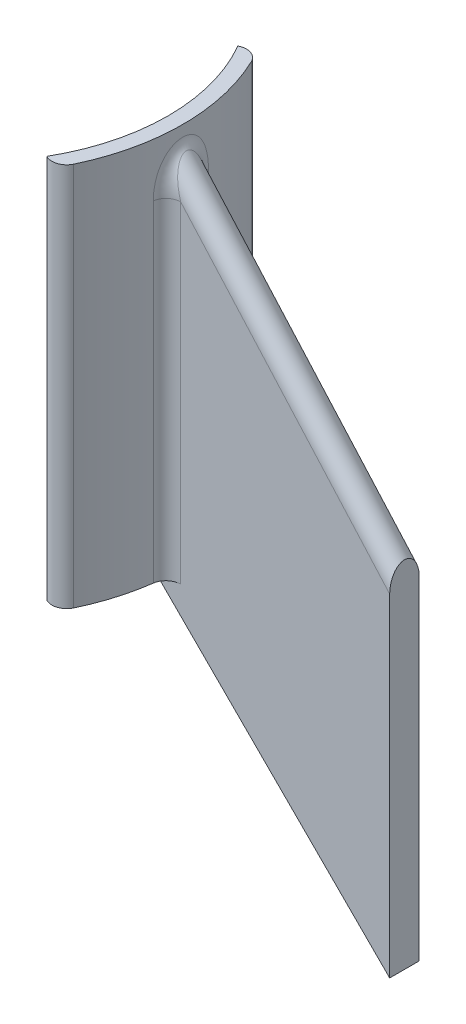
ISO-10303-21;
HEADER;
FILE_DESCRIPTION(('STEP AP214'),'2;1');
FILE_NAME('part.step','',(''),(''),'','','');
FILE_SCHEMA(('AUTOMOTIVE_DESIGN { 1 0 10303 214 1 1 1 1 }'));
ENDSEC;
DATA;
#1=APPLICATION_CONTEXT('core data for automotive mechanical design processes');
#2=APPLICATION_PROTOCOL_DEFINITION('international standard','automotive_design',2000,#1);
#3=PRODUCT_CONTEXT('',#1,'mechanical');
#4=PRODUCT('Part','Part','',(#3));
#5=PRODUCT_RELATED_PRODUCT_CATEGORY('part','',(#4));
#6=PRODUCT_DEFINITION_FORMATION('','',#4);
#7=PRODUCT_DEFINITION_CONTEXT('part definition',#1,'design');
#8=PRODUCT_DEFINITION('design','',#6,#7);
#9=PRODUCT_DEFINITION_SHAPE('','',#8);
#10=(LENGTH_UNIT() NAMED_UNIT(*) SI_UNIT(.MILLI.,.METRE.));
#11=(NAMED_UNIT(*) PLANE_ANGLE_UNIT() SI_UNIT($,.RADIAN.));
#12=(NAMED_UNIT(*) SI_UNIT($,.STERADIAN.) SOLID_ANGLE_UNIT());
#13=UNCERTAINTY_MEASURE_WITH_UNIT(LENGTH_MEASURE(1.E-05),#10,'distance_accuracy_value','');
#14=(GEOMETRIC_REPRESENTATION_CONTEXT(3) GLOBAL_UNCERTAINTY_ASSIGNED_CONTEXT((#13)) GLOBAL_UNIT_ASSIGNED_CONTEXT((#10,
#11,#12)) REPRESENTATION_CONTEXT('',''));
#15=CARTESIAN_POINT('',(0.,0.,0.));
#16=DIRECTION('',(0.,0.,1.));
#17=DIRECTION('',(1.,0.,0.));
#18=AXIS2_PLACEMENT_3D('',#15,#16,#17);
#19=CARTESIAN_POINT('',(25.4,10.3104960757709,0.));
#20=DIRECTION('',(0.66436383882992,-0.74740931868366,0.));
#21=DIRECTION('',(0.74740931868366,0.66436383882992,0.));
#22=AXIS2_PLACEMENT_3D('',#19,#20,#21);
#23=CYLINDRICAL_SURFACE('',#22,1.5875);
#24=DIRECTION('',(-0.66436383882992,0.74740931868366,0.));
#25=VECTOR('',#24,1.);
#26=CARTESIAN_POINT('',(25.4,10.3104960757709,-1.5875));
#27=LINE('',#26,#25);
#28=CARTESIAN_POINT('',(2.9613493514353,35.5539780554062,-1.5875));
#29=VERTEX_POINT('',#28);
#30=CARTESIAN_POINT('',(25.4,10.3104960757709,-1.5875));
#31=VERTEX_POINT('',#30);
#32=EDGE_CURVE('E214',#29,#31,#27,.F.);
#33=ORIENTED_EDGE('',*,*,#32,.F.);
#34=CARTESIAN_POINT('',(3.59489270934857,33.6692249356038,-1.38342591651376));
#35=CARTESIAN_POINT('',(1.66450274812865,33.8531991702857,-0.640160515766245));
#36=CARTESIAN_POINT('',(1.43628279119716,33.151920950103,-2.58150538119055));
#37=CARTESIAN_POINT('',(3.54162523136298,33.8202744181575,-1.41744319857437));
#38=CARTESIAN_POINT('',(1.65716833460848,33.9558396265715,-0.750048638216707));
#39=CARTESIAN_POINT('',(1.42880011824856,33.343190491055,-2.64498243166125));
#40=CARTESIAN_POINT('',(3.48815968884577,33.9735062137025,-1.44707761095083));
#41=CARTESIAN_POINT('',(1.64916467959694,34.0739132963647,-0.854760834684482));
#42=CARTESIAN_POINT('',(1.42204045869648,33.5375072235243,-2.70028094391892));
#43=CARTESIAN_POINT('',(3.38141367149039,34.2830011974554,-1.49781228545414));
#44=CARTESIAN_POINT('',(1.63300903326666,34.3298197916222,-1.04652770499985));
#45=CARTESIAN_POINT('',(1.41019467683747,33.9306019708035,-2.79495304283463));
#46=CARTESIAN_POINT('',(3.3281331836946,34.4392641681594,-1.5189131575539));
#47=CARTESIAN_POINT('',(1.62484249228196,34.467213579395,-1.13450183805158));
#48=CARTESIAN_POINT('',(1.4051084349204,34.1293796656739,-2.83432776771651));
#49=CARTESIAN_POINT('',(3.22182141093651,34.7550228675257,-1.55298033450859));
#50=CARTESIAN_POINT('',(1.60898348783985,34.7571282964656,-1.29310669408509));
#51=CARTESIAN_POINT('',(1.39679604394878,34.5317184279327,-2.89789792325998));
#52=CARTESIAN_POINT('',(3.16879746303373,34.914535235632,-1.56586637231004));
#53=CARTESIAN_POINT('',(1.60125560997622,34.9096965100541,-1.36440944399061));
#54=CARTESIAN_POINT('',(1.39358827338848,34.7353071223007,-2.9219435737078));
#55=CARTESIAN_POINT('',(3.06402559791575,35.2340787786359,-1.58312460413454));
#56=CARTESIAN_POINT('',(1.58685162371045,35.2243005115616,-1.4886898249906));
#57=CARTESIAN_POINT('',(1.38926870918922,35.1438659236749,-2.95414784124104));
#58=CARTESIAN_POINT('',(3.0122776564869,35.3941099436235,-1.58749695983716));
#59=CARTESIAN_POINT('',(1.58012736653066,35.3863948392444,-1.54236607704637));
#60=CARTESIAN_POINT('',(1.38815687574725,35.3488360043737,-2.96230676002437));
#61=CARTESIAN_POINT('',(2.86945854876354,35.8424307949672,-1.58750548541725));
#62=CARTESIAN_POINT('',(1.56344903846906,35.8447580152866,-1.6658135722436));
#63=CARTESIAN_POINT('',(1.38816963599713,35.9241193297331,-2.962322668879));
#64=CARTESIAN_POINT('',(2.78023612113473,36.1303527051084,-1.573286403862));
#65=CARTESIAN_POINT('',(1.5546832822487,36.1541243311399,-1.71891902966881));
#66=CARTESIAN_POINT('',(1.39181229952212,36.2948204637239,-2.93578952745725));
#67=CARTESIAN_POINT('',(2.65286076897851,36.5538786035853,-1.5284238540687));
#68=CARTESIAN_POINT('',(1.54597029194793,36.6227116083428,-1.75113671202605));
#69=CARTESIAN_POINT('',(1.40279632602377,36.8420334804584,-2.8520749517006));
#70=CARTESIAN_POINT('',(2.611530861464,36.6934757353711,-1.50958913780221));
#71=CARTESIAN_POINT('',(1.54379705497258,36.7774156559363,-1.75434265723203));
#72=CARTESIAN_POINT('',(1.40736766159946,37.0227234611661,-2.81692892702149));
#73=CARTESIAN_POINT('',(2.53130388676764,36.9687655080953,-1.46352584024842));
#74=CARTESIAN_POINT('',(1.54092985916047,37.0849278019303,-1.74477117326519));
#75=CARTESIAN_POINT('',(1.41823929104132,37.3796836013063,-2.73097372760657));
#76=CARTESIAN_POINT('',(2.49240568798525,37.1044599490443,-1.43630119873544));
#77=CARTESIAN_POINT('',(1.54020656133268,37.2380020476417,-1.73228024515485));
#78=CARTESIAN_POINT('',(1.4245387732454,37.5559557933389,-2.68017190458255));
#79=CARTESIAN_POINT('',(2.40892636460624,37.4005163223036,-1.36555267311309));
#80=CARTESIAN_POINT('',(1.54021297435634,37.5734525243332,-1.6858572566693));
#81=CARTESIAN_POINT('',(1.44030172935886,37.9412335225234,-2.54815348758628));
#82=CARTESIAN_POINT('',(2.36505646074445,37.55949526049,-1.31973275513492));
#83=CARTESIAN_POINT('',(1.54127078507498,37.7558610522902,-1.64799332847812));
#84=CARTESIAN_POINT('',(1.45015874314771,38.1485987984515,-2.46265244029106));
#85=CARTESIAN_POINT('',(2.30325022466707,37.7880687736399,-1.23987194634268));
#86=CARTESIAN_POINT('',(1.54427890620739,38.020536237965,-1.57085264971859));
#87=CARTESIAN_POINT('',(1.46617491103183,38.4473699381431,-2.31363028800059));
#88=CARTESIAN_POINT('',(2.28332461295915,37.8625718804582,-1.21141554612985));
#89=CARTESIAN_POINT('',(1.54550594674742,38.1067888741768,-1.54199569968381));
#90=CARTESIAN_POINT('',(1.4717152988253,38.5448630780235,-2.260529974197));
#91=CARTESIAN_POINT('',(2.24489498357759,38.0077417450717,-1.15058581562139));
#92=CARTESIAN_POINT('',(1.54835440844677,38.2752669962179,-1.4774484267008));
#93=CARTESIAN_POINT('',(1.48308603591916,38.7350256185562,-2.14702026261931));
#94=CARTESIAN_POINT('',(2.22639302107157,38.0784029150839,-1.1182069901994));
#95=CARTESIAN_POINT('',(1.54997429778172,38.3575739903432,-1.4417795804239));
#96=CARTESIAN_POINT('',(1.48891678511162,38.8276879855908,-2.08660061080974));
#97=CARTESIAN_POINT('',(2.18084027230633,38.2541387559178,-1.02968962467703));
#98=CARTESIAN_POINT('',(1.5545314739478,38.5622911333085,-1.34121965909119));
#99=CARTESIAN_POINT('',(1.50408986890475,39.0583706948882,-1.92142511966131));
#100=CARTESIAN_POINT('',(2.15497249992597,38.3557073795875,-0.97057480775539));
#101=CARTESIAN_POINT('',(1.55770298504972,38.6815595494916,-1.27105113785414));
#102=CARTESIAN_POINT('',(1.51352824413473,39.1919249211285,-1.81111547779992));
#103=CARTESIAN_POINT('',(2.10801595921375,38.5427027327189,-0.842394916640645));
#104=CARTESIAN_POINT('',(1.56431992337107,38.9014851812506,-1.11373494321957));
#105=CARTESIAN_POINT('',(1.53187632136377,39.4381398030271,-1.57192877853643));
#106=CARTESIAN_POINT('',(2.08691691366914,38.6281641079795,-0.773351775390359));
#107=CARTESIAN_POINT('',(1.56776835837864,39.0025505575648,-1.02663215091474));
#108=CARTESIAN_POINT('',(1.54078712912625,39.5508452932577,-1.44309264852464));
#109=CARTESIAN_POINT('',(2.05365863294307,38.7644185610334,-0.639617301863592));
#110=CARTESIAN_POINT('',(1.57370878261375,39.1638397419136,-0.854380275044514));
#111=CARTESIAN_POINT('',(1.55554769206405,39.7307251859476,-1.19354096725358));
#112=CARTESIAN_POINT('',(2.0405680350761,38.8186993130875,-0.576476694242292));
#113=CARTESIAN_POINT('',(1.57626240619309,39.2282926910019,-0.771873899150259));
#114=CARTESIAN_POINT('',(1.56165884870051,39.8024641800718,-1.07571910467139));
#115=CARTESIAN_POINT('',(2.01853639969287,38.9106851330174,-0.445075063268701));
#116=CARTESIAN_POINT('',(1.58076254887938,39.3374918733171,-0.598433550727192));
#117=CARTESIAN_POINT('',(1.57223617453962,39.9241107912883,-0.830520562900815));
#118=CARTESIAN_POINT('',(2.00959300682146,38.9483996088665,-0.376816971983618));
#119=CARTESIAN_POINT('',(1.58271539615204,39.3824149245563,-0.507404489404979));
#120=CARTESIAN_POINT('',(1.57670327716472,39.9740307992832,-0.703149355019036));
#121=CARTESIAN_POINT('',(1.99620286003621,39.0050668896184,-0.236504560038927));
#122=CARTESIAN_POINT('',(1.58570082413519,39.4498429168855,-0.319324371479788));
#123=CARTESIAN_POINT('',(1.58348447789697,40.0490609448439,-0.441323085764676));
#124=CARTESIAN_POINT('',(1.99178060965184,39.0239174449633,-0.164431756199035));
#125=CARTESIAN_POINT('',(1.58673328001718,39.4723403083685,-0.222095824525345));
#126=CARTESIAN_POINT('',(1.5857868382621,40.0740358692825,-0.306833534342053));
#127=CARTESIAN_POINT('',(1.98774441279612,39.0411163709632,-0.0192083437634006));
#128=CARTESIAN_POINT('',(1.58767191500143,39.492828237609,-0.0260286607763088));
#129=CARTESIAN_POINT('',(1.58788542103124,40.0968218648759,-0.0358432223972824));
#130=CARTESIAN_POINT('',(1.98812906100291,39.0394707337874,0.0539419435779906));
#131=CARTESIAN_POINT('',(1.58758010065756,39.4908624932881,0.0729827771841793));
#132=CARTESIAN_POINT('',(1.58768237590382,40.0946408752043,0.100656938656667));
#133=CARTESIAN_POINT('',(1.99342785088667,39.0169063369655,0.192185875550042));
#134=CARTESIAN_POINT('',(1.58635276569982,39.4639880147008,0.259505330184917));
#135=CARTESIAN_POINT('',(1.58493410887458,40.0647481437249,0.358623375493032));
#136=CARTESIAN_POINT('',(1.99792995889403,38.9977408651286,0.257410691004518));
#137=CARTESIAN_POINT('',(1.58531039825468,39.4411266520323,0.347390523966315));
#138=CARTESIAN_POINT('',(1.58260198115763,40.0393589586576,0.480334419125556));
#139=CARTESIAN_POINT('',(2.01070039156772,38.9437338076048,0.384903054423961));
#140=CARTESIAN_POINT('',(1.58247540097696,39.3768701816334,0.518155067948243));
#141=CARTESIAN_POINT('',(1.57615203618127,39.9678554836933,0.718238175514828));
#142=CARTESIAN_POINT('',(2.01896892231448,38.9088913641509,0.447170440366808));
#143=CARTESIAN_POINT('',(1.5806789462423,39.3353846545979,0.601142453997436));
#144=CARTESIAN_POINT('',(1.57203412121281,39.9217400597587,0.834430585934478));
#145=CARTESIAN_POINT('',(2.03933509864765,38.8238353092341,0.569597672891446));
#146=CARTESIAN_POINT('',(1.57651095819776,39.2344003663495,0.762800940680838));
#147=CARTESIAN_POINT('',(1.56224534692473,39.8092548819521,1.06288268864503));
#148=CARTESIAN_POINT('',(2.05155949709567,38.7731150000676,0.629601721402336));
#149=CARTESIAN_POINT('',(1.57411638585249,39.1741775549775,0.841283483326352));
#150=CARTESIAN_POINT('',(1.55652406579529,39.742217723847,1.17485165806246));
#151=CARTESIAN_POINT('',(2.07934121458467,38.659123921664,0.744147360314747));
#152=CARTESIAN_POINT('',(1.5691000023602,39.039288293587,0.989049590234602));
#153=CARTESIAN_POINT('',(1.54411378968667,39.5917084015867,1.38859652123408));
#154=CARTESIAN_POINT('',(2.09490026210266,38.5958466449322,0.798686096236414));
#155=CARTESIAN_POINT('',(1.5664736545586,38.9644514254677,1.05837442910099));
#156=CARTESIAN_POINT('',(1.53742429343039,39.5082277159413,1.49036708846154));
#157=CARTESIAN_POINT('',(2.13698805316102,38.4268071195881,0.926145126294138));
#158=CARTESIAN_POINT('',(1.56006393076651,38.7649767804016,1.21754039382777));
#159=CARTESIAN_POINT('',(1.52031475511109,39.2854764067187,1.72820864404842));
#160=CARTESIAN_POINT('',(2.16523621674051,38.3150518322696,0.995663054203683));
#161=CARTESIAN_POINT('',(1.55632420635856,38.6334465077157,1.30138353436767));
#162=CARTESIAN_POINT('',(1.50961860681946,39.1384213221639,1.85793073683843));
#163=CARTESIAN_POINT('',(2.2270342472525,38.0754521731192,1.12192879445164));
#164=CARTESIAN_POINT('',(1.54974026427745,38.3534070247304,1.44713369287093));
#165=CARTESIAN_POINT('',(1.48848221853948,38.8237532493058,2.09354558548451));
#166=CARTESIAN_POINT('',(2.26059613077875,37.9475714715747,1.17864693836378));
#167=CARTESIAN_POINT('',(1.54690200438701,38.2043424710329,1.50887780314428));
#168=CARTESIAN_POINT('',(1.47804262207778,38.6560938629665,2.1993829793572));
#169=CARTESIAN_POINT('',(2.34597078628799,37.6288066714074,1.29955519900095));
#170=CARTESIAN_POINT('',(1.54177285012085,37.8346279827932,1.63132008984863));
#171=CARTESIAN_POINT('',(1.4545153236335,38.2390258074592,2.42500064457961));
#172=CARTESIAN_POINT('',(2.39981854385769,37.4327001720848,1.35813491110825));
#173=CARTESIAN_POINT('',(1.54017753790818,37.608945316922,1.68138600457184));
#174=CARTESIAN_POINT('',(1.44196744203741,37.983100153612,2.53431176863885));
#175=CARTESIAN_POINT('',(2.51408105314508,37.0277105839152,1.45435844092386));
#176=CARTESIAN_POINT('',(1.5402434804113,37.1492963576173,1.74408712811054));
#177=CARTESIAN_POINT('',(1.42050223017806,37.4560937863336,2.71386714423629));
#178=CARTESIAN_POINT('',(2.57450178421246,36.8188159386639,1.49198300238685));
#179=CARTESIAN_POINT('',(1.54199078595895,36.9142698116023,1.75584947741736));
#180=CARTESIAN_POINT('',(1.4115882412046,37.1849993847966,2.78407546316672));
#181=CARTESIAN_POINT('',(2.68853804282172,36.4341761816519,1.54318724369544));
#182=CARTESIAN_POINT('',(1.54806885232339,36.4901139107716,1.74594349212494));
#183=CARTESIAN_POINT('',(1.39922185843217,36.6872124979202,2.87962378487755));
#184=CARTESIAN_POINT('',(2.74128349562151,36.2596219319781,1.5599661739258));
#185=CARTESIAN_POINT('',(1.5519283711643,36.2992342223637,1.72951772747648));
#186=CARTESIAN_POINT('',(1.39505590498581,36.4618044594377,2.91093366432624));
#187=CARTESIAN_POINT('',(2.8494550895158,35.9081491467568,1.58211843663552));
#188=CARTESIAN_POINT('',(1.56159139238752,35.9215443468431,1.67492537870832));
#189=CARTESIAN_POINT('',(1.38952693945796,36.0089116501266,2.95227030886484));
#190=CARTESIAN_POINT('',(2.90487922340218,35.7312324512484,1.58750017785488));
#191=CARTESIAN_POINT('',(1.56746035382492,35.7343610886657,1.63609527540555));
#192=CARTESIAN_POINT('',(1.38816186094018,35.7814285348095,2.96231276486184));
#193=CARTESIAN_POINT('',(3.01194547956309,35.3951615902126,1.58749984064552));
#194=CARTESIAN_POINT('',(1.58009135208338,35.3875282871832,1.54265835285712));
#195=CARTESIAN_POINT('',(1.3881610362339,35.3501868829854,2.96231213568065));
#196=CARTESIAN_POINT('',(3.06338131179698,35.2360740256465,1.58317917953733));
#197=CARTESIAN_POINT('',(1.58676791088785,35.2263573364483,1.48936533052728));
#198=CARTESIAN_POINT('',(1.3892561562529,35.1464219100522,2.95424968024068));
#199=CARTESIAN_POINT('',(3.16751743130683,34.9184095538438,1.56612780942927));
#200=CARTESIAN_POINT('',(1.60107189098741,34.9134783718098,1.36604218418749));
#201=CARTESIAN_POINT('',(1.39352176414507,34.740255882452,2.92243142155007));
#202=CARTESIAN_POINT('',(3.22021816537419,34.7598328501726,1.55339408533257));
#203=CARTESIAN_POINT('',(1.60874688579975,34.7617207682314,1.29532225964848));
#204=CARTESIAN_POINT('',(1.39669299605726,34.5378553430547,2.89866999205758));
#205=CARTESIAN_POINT('',(3.32652596808269,34.4439912991749,1.51952516190033));
#206=CARTESIAN_POINT('',(1.62459995947837,34.4713800520066,1.1370776525236));
#207=CARTESIAN_POINT('',(1.40496122948075,34.1353951888338,2.83546978225371));
#208=CARTESIAN_POINT('',(3.38013495533842,34.286730664429,1.49836926937024));
#209=CARTESIAN_POINT('',(1.63281652305854,34.3329735607166,1.04870490773389));
#210=CARTESIAN_POINT('',(1.41006297270238,33.935342598628,2.79599238795357));
#211=CARTESIAN_POINT('',(3.48752763053898,33.9753170053651,1.44742736267972));
#212=CARTESIAN_POINT('',(1.6490717255165,34.0752774834691,0.855974904267142));
#213=CARTESIAN_POINT('',(1.42196023141781,33.53980341152,2.70093358889421));
#214=CARTESIAN_POINT('',(3.54131127533303,33.8211632725805,1.41764334035998));
#215=CARTESIAN_POINT('',(1.65712550854864,33.956425152695,0.750686025540699));
#216=CARTESIAN_POINT('',(1.42875535593675,33.3443157720222,2.64535590095669));
#217=CARTESIAN_POINT('',(3.59489270934857,33.6692249356038,1.38342591651376));
#218=CARTESIAN_POINT('',(1.66450274812865,33.8531991702857,0.640160515766243));
#219=CARTESIAN_POINT('',(1.43628279119716,33.151920950103,2.58150538119055));
#220=(BOUNDED_SURFACE() B_SPLINE_SURFACE(3,2,((#34,#35,#36),(#37,#38,#39),(#40,#41,#42),(#43,
#44,#45),(#46,#47,#48),(#49,#50,#51),(#52,#53,#54),(#55,#56,#57),(#58,#59,#60),(#61,#62,#63),
(#64,#65,#66),(#67,#68,#69),(#70,#71,#72),(#73,#74,#75),(#76,#77,#78),(#79,#80,#81),(#82,#83,
#84),(#85,#86,#87),(#88,#89,#90),(#91,#92,#93),(#94,#95,#96),(#97,#98,#99),(#100,#101,#102),
(#103,#104,#105),(#106,#107,#108),(#109,#110,#111),(#112,#113,#114),(#115,#116,#117),(#118,#119,
#120),(#121,#122,#123),(#124,#125,#126),(#127,#128,#129),(#130,#131,#132),(#133,#134,#135),
(#136,#137,#138),(#139,#140,#141),(#142,#143,#144),(#145,#146,#147),(#148,#149,#150),(#151,#152,
#153),(#154,#155,#156),(#157,#158,#159),(#160,#161,#162),(#163,#164,#165),(#166,#167,#168),
(#169,#170,#171),(#172,#173,#174),(#175,#176,#177),(#178,#179,#180),(#181,#182,#183),(#184,#185,
#186),(#187,#188,#189),(#190,#191,#192),(#193,#194,#195),(#196,#197,#198),(#199,#200,#201),
(#202,#203,#204),(#205,#206,#207),(#208,#209,#210),(#211,#212,#213),(#214,#215,#216),(#217,#218,
#219)),.UNSPECIFIED.,.F.,.F.,.F.) B_SPLINE_SURFACE_WITH_KNOTS((4,2,2,2,2,2,2,2,2,2,2,2,2,2,2,2,
2,2,2,2,2,2,2,2,2,2,2,2,2,2,4),(3,3),(0.,0.609141276307159,1.21823900382126,1.83320051260157,
2.44815034280517,3.55771472832728,4.11098477366082,4.66399540712163,5.34239432859106,
5.68121493220301,6.02051581893008,6.55441720144608,7.08715674782569,7.52152046253119,
7.95563718254473,8.39209443638421,8.82842409265649,9.22536419101656,9.62232601062741,
10.0335319141416,10.4449514792367,11.0496643011858,11.6557647015208,12.4965496803282,
13.338106009411,14.0207148284822,14.7028198494132,15.3139725816223,15.9253444593364,
16.5382278360872,17.1509698386848),(0.,1.),
.UNSPECIFIED.) GEOMETRIC_REPRESENTATION_ITEM() RATIONAL_B_SPLINE_SURFACE(((1.,0.60731322540512,
1.),(1.,0.621080232272997,1.),(1.,0.634416583291112,1.),(1.,0.660242996016122,1.),(1.,
0.672733118157859,1.),(1.,0.697000309924117,1.),(1.,0.708769357422416,1.),(1.,0.731484642755143,
1.),(1.,0.742430896211093,1.),(1.,0.772031299633017,1.),(1.,0.789803628383731,1.),(1.,
0.814496694198208,1.),(1.,0.822390680122311,1.),(1.,0.837531872432273,1.),(1.,0.844779380338418,
1.),(1.,0.860178955427764,1.),(1.,0.868163526337349,1.),(1.,0.87930916666944,1.),(1.,
0.882884076294242,1.),(1.,0.889750693740276,1.),(1.,0.893041992935614,1.),(1.,0.901117715900253,
1.),(1.,0.905675853976056,1.),(1.,0.913919820752332,1.),(1.,0.917607526121876,1.),(1.,
0.923407178291552,1.),(1.,0.925684356498889,1.),(1.,0.929512488474845,1.),(1.,0.931063854464249,
1.),(1.,0.933385414790712,1.),(1.,0.934151352357171,1.),(1.,0.934850457235218,1.),(1.,
0.934783867940371,1.),(1.,0.933865988909652,1.),(1.,0.933086080494691,1.),(1.,0.930871723699944,
1.),(1.,0.929437239504932,1.),(1.,0.925898680251145,1.),(1.,0.923772425429028,1.),(1.,
0.918929235690707,1.),(1.,0.916211994432622,1.),(1.,0.908839265975942,1.),(1.,0.903872931168866,
1.),(1.,0.892935656296073,1.),(1.,0.886962437204769,1.),(1.,0.871633208366894,1.),(1.,
0.861862915155641,1.),(1.,0.840776923199565,1.),(1.,0.829459814896926,1.),(1.,0.807634524392167,
1.),(1.,0.797377274204297,1.),(1.,0.775904626771752,1.),(1.,0.764689942272967,1.),(1.,
0.742499867060297,1.),(1.,0.731620928846168,1.),(1.,0.709050214652137,1.),(1.,0.697358148605842,
1.),(1.,0.673107851558143,1.),(1.,0.660547550596411,1.),(1.,0.634574222380569,1.),(1.,
0.621161392493632,1.),(1.,0.60731322540512,1.))) REPRESENTATION_ITEM('') SURFACE());
#221=CARTESIAN_POINT('',(3.59489270934857,33.6692249356038,-1.38342591651376));
#222=CARTESIAN_POINT('',(3.54162523136298,33.8202744181575,-1.41744319857437));
#223=CARTESIAN_POINT('',(3.48815968884577,33.9735062137025,-1.44707761095083));
#224=CARTESIAN_POINT('',(3.38141367149039,34.2830011974554,-1.49781228545414));
#225=CARTESIAN_POINT('',(3.3281331836946,34.4392641681594,-1.5189131575539));
#226=CARTESIAN_POINT('',(3.22182141093651,34.7550228675257,-1.55298033450859));
#227=CARTESIAN_POINT('',(3.16879746303373,34.914535235632,-1.56586637231004));
#228=CARTESIAN_POINT('',(3.06402559791575,35.2340787786359,-1.58312460413454));
#229=CARTESIAN_POINT('',(3.0122776564869,35.3941099436235,-1.58749695983716));
#230=CARTESIAN_POINT('',(2.86945854876354,35.8424307949672,-1.58750548541725));
#231=CARTESIAN_POINT('',(2.78023612113473,36.1303527051084,-1.573286403862));
#232=CARTESIAN_POINT('',(2.65286076897851,36.5538786035853,-1.5284238540687));
#233=CARTESIAN_POINT('',(2.611530861464,36.6934757353711,-1.50958913780221));
#234=CARTESIAN_POINT('',(2.53130388676764,36.9687655080953,-1.46352584024842));
#235=CARTESIAN_POINT('',(2.49240568798525,37.1044599490443,-1.43630119873544));
#236=CARTESIAN_POINT('',(2.40892636460624,37.4005163223036,-1.36555267311309));
#237=CARTESIAN_POINT('',(2.36505646074445,37.55949526049,-1.31973275513492));
#238=CARTESIAN_POINT('',(2.30325022466707,37.7880687736399,-1.23987194634268));
#239=CARTESIAN_POINT('',(2.28332461295915,37.8625718804582,-1.21141554612985));
#240=CARTESIAN_POINT('',(2.24489498357759,38.0077417450717,-1.15058581562139));
#241=CARTESIAN_POINT('',(2.22639302107157,38.0784029150839,-1.1182069901994));
#242=CARTESIAN_POINT('',(2.18084027230633,38.2541387559178,-1.02968962467703));
#243=CARTESIAN_POINT('',(2.15497249992597,38.3557073795875,-0.97057480775539));
#244=CARTESIAN_POINT('',(2.10801595921375,38.5427027327189,-0.842394916640645));
#245=CARTESIAN_POINT('',(2.08691691366914,38.6281641079795,-0.773351775390359));
#246=CARTESIAN_POINT('',(2.05365863294307,38.7644185610334,-0.639617301863592));
#247=CARTESIAN_POINT('',(2.0405680350761,38.8186993130875,-0.576476694242292));
#248=CARTESIAN_POINT('',(2.01853639969287,38.9106851330174,-0.445075063268701));
#249=CARTESIAN_POINT('',(2.00959300682146,38.9483996088665,-0.376816971983618));
#250=CARTESIAN_POINT('',(1.99620286003621,39.0050668896184,-0.236504560038927));
#251=CARTESIAN_POINT('',(1.99178060965184,39.0239174449633,-0.164431756199036));
#252=CARTESIAN_POINT('',(1.98774441279612,39.0411163709632,-0.0192083437634006));
#253=CARTESIAN_POINT('',(1.98812906100291,39.0394707337874,0.0539419435779909));
#254=CARTESIAN_POINT('',(1.99342785088667,39.0169063369655,0.192185875550042));
#255=CARTESIAN_POINT('',(1.99792995889403,38.9977408651286,0.257410691004518));
#256=CARTESIAN_POINT('',(2.01070039156772,38.9437338076048,0.384903054423961));
#257=CARTESIAN_POINT('',(2.01896892231448,38.9088913641509,0.447170440366808));
#258=CARTESIAN_POINT('',(2.03933509864765,38.8238353092341,0.569597672891446));
#259=CARTESIAN_POINT('',(2.05155949709567,38.7731150000676,0.629601721402336));
#260=CARTESIAN_POINT('',(2.07934121458467,38.659123921664,0.744147360314747));
#261=CARTESIAN_POINT('',(2.09490026210266,38.5958466449322,0.798686096236414));
#262=CARTESIAN_POINT('',(2.13698805316102,38.4268071195881,0.926145126294138));
#263=CARTESIAN_POINT('',(2.16523621674051,38.3150518322697,0.995663054203683));
#264=CARTESIAN_POINT('',(2.2270342472525,38.0754521731192,1.12192879445164));
#265=CARTESIAN_POINT('',(2.26059613077875,37.9475714715747,1.17864693836378));
#266=CARTESIAN_POINT('',(2.34597078628799,37.6288066714074,1.29955519900095));
#267=CARTESIAN_POINT('',(2.39981854385769,37.4327001720848,1.35813491110825));
#268=CARTESIAN_POINT('',(2.51408105314508,37.0277105839152,1.45435844092386));
#269=CARTESIAN_POINT('',(2.57450178421246,36.8188159386639,1.49198300238685));
#270=CARTESIAN_POINT('',(2.68853804282172,36.4341761816519,1.54318724369544));
#271=CARTESIAN_POINT('',(2.74128349562151,36.2596219319781,1.5599661739258));
#272=CARTESIAN_POINT('',(2.8494550895158,35.9081491467568,1.58211843663552));
#273=CARTESIAN_POINT('',(2.90487922340218,35.7312324512484,1.58750017785488));
#274=CARTESIAN_POINT('',(3.01194547956309,35.3951615902126,1.58749984064552));
#275=CARTESIAN_POINT('',(3.06338131179698,35.2360740256465,1.58317917953733));
#276=CARTESIAN_POINT('',(3.16751743130683,34.9184095538438,1.56612780942927));
#277=CARTESIAN_POINT('',(3.22021816537419,34.7598328501726,1.55339408533257));
#278=CARTESIAN_POINT('',(3.32652596808269,34.4439912991749,1.51952516190033));
#279=CARTESIAN_POINT('',(3.38013495533842,34.286730664429,1.49836926937024));
#280=CARTESIAN_POINT('',(3.48752763053898,33.9753170053651,1.44742736267972));
#281=CARTESIAN_POINT('',(3.54131127533303,33.8211632725805,1.41764334035998));
#282=CARTESIAN_POINT('',(3.59489270934857,33.6692249356038,1.38342591651376));
#283=B_SPLINE_CURVE_WITH_KNOTS('',3,(#221,#222,#223,#224,#225,#226,#227,#228,#229,#230,#231,
#232,#233,#234,#235,#236,#237,#238,#239,#240,#241,#242,#243,#244,#245,#246,#247,#248,#249,#250,
#251,#252,#253,#254,#255,#256,#257,#258,#259,#260,#261,#262,#263,#264,#265,#266,#267,#268,#269,
#270,#271,#272,#273,#274,#275,#276,#277,#278,#279,#280,#281,#282),.UNSPECIFIED.,.F.,.F.,(4,2,2,
2,2,2,2,2,2,2,2,2,2,2,2,2,2,2,2,2,2,2,2,2,2,2,2,2,2,2,4),(0.,0.609141276307159,1.21823900382126,
1.83320051260157,2.44815034280517,3.55771472832728,4.11098477366082,4.66399540712163,
5.34239432859106,5.68121493220301,6.02051581893008,6.55441720144608,7.08715674782569,
7.52152046253119,7.95563718254473,8.39209443638421,8.82842409265649,9.22536419101656,
9.62232601062741,10.0335319141416,10.4449514792367,11.0496643011858,11.6557647015208,
12.4965496803282,13.338106009411,14.0207148284822,14.7028198494132,15.3139725816223,
15.9253444593364,16.5382278360872,17.1509698386848),.UNSPECIFIED.);
#284=CARTESIAN_POINT('',(2.9613493514353,35.5539780554062,1.5875));
#285=VERTEX_POINT('',#284);
#286=EDGE_CURVE('E277',#29,#285,#283,.T.);
#287=ORIENTED_EDGE('',*,*,#286,.T.);
#288=DIRECTION('',(0.66436383882992,-0.74740931868366,0.));
#289=VECTOR('',#288,1.);
#290=CARTESIAN_POINT('',(19.3086601203828,17.1632534403403,1.5875));
#291=LINE('',#290,#289);
#292=CARTESIAN_POINT('',(25.4,10.3104960757709,1.5875));
#293=VERTEX_POINT('',#292);
#294=EDGE_CURVE('E210',#293,#285,#291,.F.);
#295=ORIENTED_EDGE('',*,*,#294,.F.);
#296=CARTESIAN_POINT('',(25.4,10.3104960757709,0.));
#297=DIRECTION('',(-1.,0.,0.));
#298=DIRECTION('',(0.,-1.,0.));
#299=AXIS2_PLACEMENT_3D('',#296,#297,#298);
#300=ELLIPSE('',#299,2.38950392422909,1.5875);
#301=EDGE_CURVE('E217',#31,#293,#300,.F.);
#302=ORIENTED_EDGE('',*,*,#301,.F.);
#303=EDGE_LOOP('',(#33,#287,#295,#302));
#304=FACE_BOUND('',#303,.T.);
#305=ADVANCED_FACE('F44',(#304),#23,.T.);
#306=CARTESIAN_POINT('',(25.4,12.7,-1.5875));
#307=DIRECTION('',(-1.,0.,0.));
#308=DIRECTION('',(0.,-1.,0.));
#309=AXIS2_PLACEMENT_3D('',#306,#307,#308);
#310=PLANE('',#309);
#311=DIRECTION('',(0.,-1.,0.));
#312=VECTOR('',#311,1.);
#313=CARTESIAN_POINT('',(25.4,12.7,-1.5875));
#314=LINE('',#313,#312);
#315=CARTESIAN_POINT('',(25.4,-25.4,-1.5875));
#316=VERTEX_POINT('',#315);
#317=EDGE_CURVE('E197',#31,#316,#314,.T.);
#318=ORIENTED_EDGE('',*,*,#317,.F.);
#319=ORIENTED_EDGE('',*,*,#301,.T.);
#320=DIRECTION('',(0.,-1.,0.));
#321=VECTOR('',#320,1.);
#322=CARTESIAN_POINT('',(25.4,12.7,1.5875));
#323=LINE('',#322,#321);
#324=CARTESIAN_POINT('',(25.4,-25.4,1.5875));
#325=VERTEX_POINT('',#324);
#326=EDGE_CURVE('E190',#293,#325,#323,.T.);
#327=ORIENTED_EDGE('',*,*,#326,.T.);
#328=DIRECTION('',(0.,0.,1.));
#329=VECTOR('',#328,1.);
#330=CARTESIAN_POINT('',(25.4,-25.4,-1.5875));
#331=LINE('',#330,#329);
#332=EDGE_CURVE('E206',#316,#325,#331,.T.);
#333=ORIENTED_EDGE('',*,*,#332,.F.);
#334=EDGE_LOOP('',(#318,#319,#327,#333));
#335=FACE_BOUND('',#334,.T.);
#336=ADVANCED_FACE('F272',(#335),#310,.F.);
#337=CARTESIAN_POINT('',(25.4,-25.4,-1.5875));
#338=DIRECTION('',(0.707106781186548,0.707106781186548,0.));
#339=DIRECTION('',(-0.707106781186548,0.707106781186548,0.));
#340=AXIS2_PLACEMENT_3D('',#337,#338,#339);
#341=PLANE('',#340);
#342=ORIENTED_EDGE('',*,*,#332,.T.);
#343=DIRECTION('',(-0.707106781186547,0.707106781186547,0.));
#344=VECTOR('',#343,1.);
#345=CARTESIAN_POINT('',(25.4,-25.4,1.5875));
#346=LINE('',#345,#344);
#347=CARTESIAN_POINT('',(0.,0.,1.5875));
#348=VERTEX_POINT('',#347);
#349=EDGE_CURVE('E193',#325,#348,#346,.T.);
#350=ORIENTED_EDGE('',*,*,#349,.T.);
#351=DIRECTION('',(0.,0.,-1.));
#352=VECTOR('',#351,1.);
#353=CARTESIAN_POINT('',(0.,0.,-1.5875));
#354=LINE('',#353,#352);
#355=CARTESIAN_POINT('',(0.,0.,0.));
#356=VERTEX_POINT('',#355);
#357=EDGE_CURVE('E185',#348,#356,#354,.T.);
#358=ORIENTED_EDGE('',*,*,#357,.T.);
#359=DIRECTION('',(0.,0.,1.));
#360=VECTOR('',#359,1.);
#361=CARTESIAN_POINT('',(0.,0.,-1.5875));
#362=LINE('',#361,#360);
#363=CARTESIAN_POINT('',(0.,0.,-1.5875));
#364=VERTEX_POINT('',#363);
#365=EDGE_CURVE('E203',#364,#356,#362,.T.);
#366=ORIENTED_EDGE('',*,*,#365,.F.);
#367=DIRECTION('',(-0.707106781186547,0.707106781186547,0.));
#368=VECTOR('',#367,1.);
#369=CARTESIAN_POINT('',(25.4,-25.4,-1.5875));
#370=LINE('',#369,#368);
#371=EDGE_CURVE('E200',#316,#364,#370,.T.);
#372=ORIENTED_EDGE('',*,*,#371,.F.);
#373=EDGE_LOOP('',(#342,#350,#358,#366,#372));
#374=FACE_BOUND('',#373,.T.);
#375=ADVANCED_FACE('F374',(#374),#341,.F.);
#376=CARTESIAN_POINT('',(0.,0.,-1.5875));
#377=DIRECTION('',(0.,0.,-1.));
#378=DIRECTION('',(-1.,0.,0.));
#379=AXIS2_PLACEMENT_3D('',#376,#377,#378);
#380=PLANE('',#379);
#381=DIRECTION('',(-1.,0.,0.));
#382=VECTOR('',#381,1.);
#383=CARTESIAN_POINT('',(0.,0.,-1.5875));
#384=LINE('',#383,#382);
#385=CARTESIAN_POINT('',(2.96134935143529,0.,-1.5875));
#386=VERTEX_POINT('',#385);
#387=EDGE_CURVE('E68',#386,#364,#384,.T.);
#388=ORIENTED_EDGE('',*,*,#387,.F.);
#389=DIRECTION('',(0.,1.,0.));
#390=VECTOR('',#389,1.);
#391=CARTESIAN_POINT('',(2.96134935143529,37.1637546213491,-1.5875));
#392=LINE('',#391,#390);
#393=EDGE_CURVE('E72',#386,#29,#392,.T.);
#394=ORIENTED_EDGE('',*,*,#393,.T.);
#395=ORIENTED_EDGE('',*,*,#32,.T.);
#396=ORIENTED_EDGE('',*,*,#317,.T.);
#397=ORIENTED_EDGE('',*,*,#371,.T.);
#398=EDGE_LOOP('',(#388,#394,#395,#396,#397));
#399=FACE_BOUND('',#398,.T.);
#400=ADVANCED_FACE('F367',(#399),#380,.T.);
#401=CARTESIAN_POINT('',(0.,0.,1.5875));
#402=DIRECTION('',(0.,0.,-1.));
#403=DIRECTION('',(-1.,0.,0.));
#404=AXIS2_PLACEMENT_3D('',#401,#402,#403);
#405=PLANE('',#404);
#406=ORIENTED_EDGE('',*,*,#294,.T.);
#407=DIRECTION('',(0.,-1.,0.));
#408=VECTOR('',#407,1.);
#409=CARTESIAN_POINT('',(2.96134935143529,0.,1.5875));
#410=LINE('',#409,#408);
#411=CARTESIAN_POINT('',(2.96134935143529,0.,1.5875));
#412=VERTEX_POINT('',#411);
#413=EDGE_CURVE('E224',#285,#412,#410,.T.);
#414=ORIENTED_EDGE('',*,*,#413,.T.);
#415=DIRECTION('',(-1.,0.,0.));
#416=VECTOR('',#415,1.);
#417=CARTESIAN_POINT('',(0.,0.,1.5875));
#418=LINE('',#417,#416);
#419=EDGE_CURVE('E220',#412,#348,#418,.T.);
#420=ORIENTED_EDGE('',*,*,#419,.T.);
#421=ORIENTED_EDGE('',*,*,#349,.F.);
#422=ORIENTED_EDGE('',*,*,#326,.F.);
#423=EDGE_LOOP('',(#406,#414,#420,#421,#422));
#424=FACE_BOUND('',#423,.T.);
#425=ADVANCED_FACE('F361',(#424),#405,.F.);
#426=CARTESIAN_POINT('',(-20.5232,-0.678557848893688,0.));
#427=DIRECTION('',(0.,-1.,0.));
#428=DIRECTION('',(0.,0.,-1.));
#429=AXIS2_PLACEMENT_3D('',#426,#427,#428);
#430=CYLINDRICAL_SURFACE('',#429,20.5232);
#431=DIRECTION('',(0.,-1.,0.));
#432=VECTOR('',#431,1.);
#433=CARTESIAN_POINT('',(-2.74958743305122,41.275,10.2616));
#434=LINE('',#433,#432);
#435=CARTESIAN_POINT('',(-2.74958743305122,41.275,10.2616));
#436=VERTEX_POINT('',#435);
#437=CARTESIAN_POINT('',(-2.74958743305122,0.,10.2616));
#438=VERTEX_POINT('',#437);
#439=EDGE_CURVE('E156',#436,#438,#434,.T.);
#440=ORIENTED_EDGE('',*,*,#439,.F.);
#441=CARTESIAN_POINT('',(-20.5232,41.275,0.));
#442=DIRECTION('',(0.,-1.,0.));
#443=DIRECTION('',(0.,0.,-1.));
#444=AXIS2_PLACEMENT_3D('',#441,#442,#443);
#445=CIRCLE('',#444,20.5232);
#446=CARTESIAN_POINT('',(-2.74958743305122,41.275,-10.2616));
#447=VERTEX_POINT('',#446);
#448=EDGE_CURVE('E171',#447,#436,#445,.T.);
#449=ORIENTED_EDGE('',*,*,#448,.F.);
#450=DIRECTION('',(0.,-1.,0.));
#451=VECTOR('',#450,1.);
#452=CARTESIAN_POINT('',(-2.74958743305122,41.275,-10.2616));
#453=LINE('',#452,#451);
#454=CARTESIAN_POINT('',(-2.74958743305122,0.,-10.2616));
#455=VERTEX_POINT('',#454);
#456=EDGE_CURVE('E166',#447,#455,#453,.T.);
#457=ORIENTED_EDGE('',*,*,#456,.T.);
#458=CARTESIAN_POINT('',(-20.5232,0.,0.));
#459=DIRECTION('',(0.,-1.,0.));
#460=DIRECTION('',(0.,0.,-1.));
#461=AXIS2_PLACEMENT_3D('',#458,#459,#460);
#462=CIRCLE('',#461,20.5232);
#463=EDGE_CURVE('E158',#455,#356,#462,.T.);
#464=ORIENTED_EDGE('',*,*,#463,.T.);
#465=EDGE_CURVE('E141',#356,#438,#462,.T.);
#466=ORIENTED_EDGE('',*,*,#465,.T.);
#467=EDGE_LOOP('',(#440,#449,#457,#464,#466));
#468=FACE_BOUND('',#467,.T.);
#469=ADVANCED_FACE('F154',(#468),#430,.F.);
#470=CARTESIAN_POINT('',(-2.74958743305122,0.,-10.2616));
#471=DIRECTION('',(0.,-1.,0.));
#472=DIRECTION('',(0.,0.,-1.));
#473=AXIS2_PLACEMENT_3D('',#470,#471,#472);
#474=PLANE('',#473);
#475=CARTESIAN_POINT('',(-20.5232,0.,0.));
#476=DIRECTION('',(0.,-1.,0.));
#477=DIRECTION('',(0.,0.,-1.));
#478=AXIS2_PLACEMENT_3D('',#475,#476,#477);
#479=CIRCLE('',#478,22.1107);
#480=CARTESIAN_POINT('',(1.38816142596401,0.,2.96231243301179));
#481=VERTEX_POINT('',#480);
#482=CARTESIAN_POINT('',(-0.577549110326318,0.,9.54222537342622));
#483=VERTEX_POINT('',#482);
#484=EDGE_CURVE('E144',#481,#483,#479,.T.);
#485=ORIENTED_EDGE('',*,*,#484,.T.);
#486=CARTESIAN_POINT('',(-2.00960330975722,0.,8.85711441898724));
#487=DIRECTION('',(0.,-1.,0.));
#488=DIRECTION('',(0.,0.,-1.));
#489=AXIS2_PLACEMENT_3D('',#486,#487,#488);
#490=CIRCLE('',#489,1.5875);
#491=EDGE_CURVE('E138',#483,#438,#490,.T.);
#492=ORIENTED_EDGE('',*,*,#491,.T.);
#493=ORIENTED_EDGE('',*,*,#465,.F.);
#494=ORIENTED_EDGE('',*,*,#357,.F.);
#495=ORIENTED_EDGE('',*,*,#419,.F.);
#496=CARTESIAN_POINT('',(2.96134935143529,0.,3.175));
#497=DIRECTION('',(0.,-1.,0.));
#498=DIRECTION('',(0.,0.,-1.));
#499=AXIS2_PLACEMENT_3D('',#496,#497,#498);
#500=CIRCLE('',#499,1.5875);
#501=EDGE_CURVE('E60',#412,#481,#500,.F.);
#502=ORIENTED_EDGE('',*,*,#501,.T.);
#503=EDGE_LOOP('',(#485,#492,#493,#494,#495,#502));
#504=FACE_BOUND('',#503,.T.);
#505=ADVANCED_FACE('F140',(#504),#474,.T.);
#506=ORIENTED_EDGE('',*,*,#463,.F.);
#507=CARTESIAN_POINT('',(-2.00960330975721,0.,-8.85711441898722));
#508=DIRECTION('',(0.,-1.,0.));
#509=DIRECTION('',(0.,0.,-1.));
#510=AXIS2_PLACEMENT_3D('',#507,#508,#509);
#511=CIRCLE('',#510,1.5875);
#512=CARTESIAN_POINT('',(-0.577549110326304,0.,-9.5422253734262));
#513=VERTEX_POINT('',#512);
#514=EDGE_CURVE('E149',#455,#513,#511,.T.);
#515=ORIENTED_EDGE('',*,*,#514,.T.);
#516=CARTESIAN_POINT('',(1.38816142596401,0.,-2.96231243301179));
#517=VERTEX_POINT('',#516);
#518=EDGE_CURVE('E161',#513,#517,#479,.T.);
#519=ORIENTED_EDGE('',*,*,#518,.T.);
#520=CARTESIAN_POINT('',(2.96134935143529,0.,-3.175));
#521=DIRECTION('',(0.,-1.,0.));
#522=DIRECTION('',(0.,0.,-1.));
#523=AXIS2_PLACEMENT_3D('',#520,#521,#522);
#524=CIRCLE('',#523,1.5875);
#525=EDGE_CURVE('E11',#517,#386,#524,.F.);
#526=ORIENTED_EDGE('',*,*,#525,.T.);
#527=ORIENTED_EDGE('',*,*,#387,.T.);
#528=ORIENTED_EDGE('',*,*,#365,.T.);
#529=EDGE_LOOP('',(#506,#515,#519,#526,#527,#528));
#530=FACE_BOUND('',#529,.T.);
#531=ADVANCED_FACE('F252',(#530),#474,.T.);
#532=CARTESIAN_POINT('',(-20.5232,-0.678557848893688,0.));
#533=DIRECTION('',(0.,-1.,0.));
#534=DIRECTION('',(0.,0.,-1.));
#535=AXIS2_PLACEMENT_3D('',#532,#533,#534);
#536=CYLINDRICAL_SURFACE('',#535,22.1107);
#537=CARTESIAN_POINT('',(-20.5232,41.275,0.));
#538=DIRECTION('',(0.,-1.,0.));
#539=DIRECTION('',(0.,0.,-1.));
#540=AXIS2_PLACEMENT_3D('',#537,#538,#539);
#541=CIRCLE('',#540,22.1107);
#542=CARTESIAN_POINT('',(-0.577549110326304,41.275,-9.5422253734262));
#543=VERTEX_POINT('',#542);
#544=CARTESIAN_POINT('',(-0.577549110326314,41.275,9.54222537342623));
#545=VERTEX_POINT('',#544);
#546=EDGE_CURVE('E178',#543,#545,#541,.T.);
#547=ORIENTED_EDGE('',*,*,#546,.T.);
#548=DIRECTION('',(0.,-1.,0.));
#549=VECTOR('',#548,1.);
#550=CARTESIAN_POINT('',(-0.577549110326314,-0.678557848893688,9.54222537342623));
#551=LINE('',#550,#549);
#552=EDGE_CURVE('E286',#545,#483,#551,.T.);
#553=ORIENTED_EDGE('',*,*,#552,.T.);
#554=ORIENTED_EDGE('',*,*,#484,.F.);
#555=DIRECTION('',(0.,-1.,0.));
#556=VECTOR('',#555,1.);
#557=CARTESIAN_POINT('',(1.38816142596402,-0.678557848893688,2.96231243301179));
#558=LINE('',#557,#556);
#559=CARTESIAN_POINT('',(1.38816142596401,35.5539780554062,2.96231243301179));
#560=VERTEX_POINT('',#559);
#561=EDGE_CURVE('E240',#481,#560,#558,.F.);
#562=ORIENTED_EDGE('',*,*,#561,.T.);
#563=CARTESIAN_POINT('',(1.43628279119716,33.151920950103,2.58150538119055));
#564=CARTESIAN_POINT('',(1.42875535593675,33.3443157720222,2.64535590095669));
#565=CARTESIAN_POINT('',(1.42196023141781,33.53980341152,2.70093358889421));
#566=CARTESIAN_POINT('',(1.41006297270238,33.935342598628,2.79599238795357));
#567=CARTESIAN_POINT('',(1.40496122948075,34.1353951888338,2.83546978225371));
#568=CARTESIAN_POINT('',(1.39669299605726,34.5378553430547,2.89866999205758));
#569=CARTESIAN_POINT('',(1.39352176414507,34.740255882452,2.92243142155007));
#570=CARTESIAN_POINT('',(1.3892561562529,35.1464219100522,2.95424968024068));
#571=CARTESIAN_POINT('',(1.3881610362339,35.3501868829854,2.96231213568065));
#572=CARTESIAN_POINT('',(1.38816186094018,35.7814285348096,2.96231276486184));
#573=CARTESIAN_POINT('',(1.38952693945796,36.0089116501266,2.95227030886484));
#574=CARTESIAN_POINT('',(1.39505590498581,36.4618044594377,2.91093366432624));
#575=CARTESIAN_POINT('',(1.39922185843217,36.6872124979202,2.87962378487755));
#576=CARTESIAN_POINT('',(1.4115882412046,37.1849993847966,2.78407546316672));
#577=CARTESIAN_POINT('',(1.42050223017806,37.4560937863336,2.71386714423629));
#578=CARTESIAN_POINT('',(1.44196744203741,37.983100153612,2.53431176863885));
#579=CARTESIAN_POINT('',(1.4545153236335,38.2390258074592,2.42500064457961));
#580=CARTESIAN_POINT('',(1.47804262207778,38.6560938629665,2.1993829793572));
#581=CARTESIAN_POINT('',(1.48848221853948,38.8237532493058,2.09354558548451));
#582=CARTESIAN_POINT('',(1.50961860681946,39.1384213221639,1.85793073683843));
#583=CARTESIAN_POINT('',(1.52031475511109,39.2854764067187,1.72820864404842));
#584=CARTESIAN_POINT('',(1.53742429343039,39.5082277159413,1.49036708846154));
#585=CARTESIAN_POINT('',(1.54411378968667,39.5917084015867,1.38859652123408));
#586=CARTESIAN_POINT('',(1.55652406579529,39.742217723847,1.17485165806246));
#587=CARTESIAN_POINT('',(1.56224534692473,39.8092548819521,1.06288268864503));
#588=CARTESIAN_POINT('',(1.57203412121281,39.9217400597587,0.834430585934478));
#589=CARTESIAN_POINT('',(1.57615203618127,39.9678554836933,0.718238175514828));
#590=CARTESIAN_POINT('',(1.58260198115763,40.0393589586576,0.480334419125556));
#591=CARTESIAN_POINT('',(1.58493410887458,40.0647481437249,0.358623375493032));
#592=CARTESIAN_POINT('',(1.58768237590382,40.0946408752043,0.100656938656668));
#593=CARTESIAN_POINT('',(1.58788542103124,40.0968218648759,-0.0358432223972825));
#594=CARTESIAN_POINT('',(1.5857868382621,40.0740358692825,-0.306833534342054));
#595=CARTESIAN_POINT('',(1.58348447789697,40.0490609448439,-0.441323085764676));
#596=CARTESIAN_POINT('',(1.57670327716472,39.9740307992832,-0.703149355019036));
#597=CARTESIAN_POINT('',(1.57223617453962,39.9241107912883,-0.830520562900814));
#598=CARTESIAN_POINT('',(1.56165884870051,39.8024641800718,-1.07571910467139));
#599=CARTESIAN_POINT('',(1.55554769206405,39.7307251859476,-1.19354096725358));
#600=CARTESIAN_POINT('',(1.54078712912625,39.5508452932577,-1.44309264852464));
#601=CARTESIAN_POINT('',(1.53187632136377,39.4381398030271,-1.57192877853643));
#602=CARTESIAN_POINT('',(1.51352824413473,39.1919249211285,-1.81111547779992));
#603=CARTESIAN_POINT('',(1.50408986890475,39.0583706948882,-1.92142511966131));
#604=CARTESIAN_POINT('',(1.48891678511162,38.8276879855908,-2.08660061080974));
#605=CARTESIAN_POINT('',(1.48308603591916,38.7350256185562,-2.14702026261931));
#606=CARTESIAN_POINT('',(1.4717152988253,38.5448630780235,-2.260529974197));
#607=CARTESIAN_POINT('',(1.46617491103183,38.4473699381431,-2.31363028800059));
#608=CARTESIAN_POINT('',(1.45015874314771,38.1485987984515,-2.46265244029106));
#609=CARTESIAN_POINT('',(1.44030172935886,37.9412335225234,-2.54815348758628));
#610=CARTESIAN_POINT('',(1.4245387732454,37.5559557933389,-2.68017190458255));
#611=CARTESIAN_POINT('',(1.41823929104132,37.3796836013063,-2.73097372760657));
#612=CARTESIAN_POINT('',(1.40736766159946,37.0227234611661,-2.81692892702149));
#613=CARTESIAN_POINT('',(1.40279632602377,36.8420334804584,-2.8520749517006));
#614=CARTESIAN_POINT('',(1.39181229952212,36.2948204637239,-2.93578952745725));
#615=CARTESIAN_POINT('',(1.38816963599713,35.9241193297331,-2.962322668879));
#616=CARTESIAN_POINT('',(1.38815687574725,35.3488360043737,-2.96230676002437));
#617=CARTESIAN_POINT('',(1.38926870918922,35.1438659236749,-2.95414784124104));
#618=CARTESIAN_POINT('',(1.39358827338848,34.7353071223007,-2.9219435737078));
#619=CARTESIAN_POINT('',(1.39679604394878,34.5317184279327,-2.89789792325998));
#620=CARTESIAN_POINT('',(1.4051084349204,34.1293796656739,-2.83432776771651));
#621=CARTESIAN_POINT('',(1.41019467683747,33.9306019708035,-2.79495304283463));
#622=CARTESIAN_POINT('',(1.42204045869648,33.5375072235243,-2.70028094391892));
#623=CARTESIAN_POINT('',(1.42880011824856,33.343190491055,-2.64498243166125));
#624=CARTESIAN_POINT('',(1.43628279119716,33.151920950103,-2.58150538119055));
#625=B_SPLINE_CURVE_WITH_KNOTS('',3,(#563,#564,#565,#566,#567,#568,#569,#570,#571,#572,#573,
#574,#575,#576,#577,#578,#579,#580,#581,#582,#583,#584,#585,#586,#587,#588,#589,#590,#591,#592,
#593,#594,#595,#596,#597,#598,#599,#600,#601,#602,#603,#604,#605,#606,#607,#608,#609,#610,#611,
#612,#613,#614,#615,#616,#617,#618,#619,#620,#621,#622,#623,#624),.UNSPECIFIED.,.F.,.F.,(4,2,2,
2,2,2,2,2,2,2,2,2,2,2,2,2,2,2,2,2,2,2,2,2,2,2,2,2,2,2,4),(0.,0.612742002597606,1.22562537934839,
1.83699725706251,2.44814998927165,3.13025501020259,3.81286382927387,4.6544201583566,
5.49520513716407,6.10130553749903,6.70601835944816,7.11743792454328,7.52864382805742,
7.92560564766828,8.32254574602835,8.75887540230063,9.1953326561401,9.62944937615364,
10.0638130908591,10.5965526372388,11.1304540197548,11.4697549064818,11.8085755100938,
12.4869744315632,13.039985065024,13.5932551103576,14.7028194958797,15.3177693260833,
15.9327308348636,16.5418285623777,17.1509698386848),.UNSPECIFIED.);
#626=CARTESIAN_POINT('',(1.38816142596401,35.5539780554062,-2.96231243301179));
#627=VERTEX_POINT('',#626);
#628=EDGE_CURVE('E231',#560,#627,#625,.T.);
#629=ORIENTED_EDGE('',*,*,#628,.T.);
#630=DIRECTION('',(0.,-1.,0.));
#631=VECTOR('',#630,1.);
#632=CARTESIAN_POINT('',(1.38816142596402,-0.678557848893688,-2.96231243301179));
#633=LINE('',#632,#631);
#634=EDGE_CURVE('E228',#627,#517,#633,.T.);
#635=ORIENTED_EDGE('',*,*,#634,.T.);
#636=ORIENTED_EDGE('',*,*,#518,.F.);
#637=DIRECTION('',(0.,-1.,0.));
#638=VECTOR('',#637,1.);
#639=CARTESIAN_POINT('',(-0.5775491103263,-0.678557848893688,-9.5422253734262));
#640=LINE('',#639,#638);
#641=EDGE_CURVE('E320',#513,#543,#640,.F.);
#642=ORIENTED_EDGE('',*,*,#641,.T.);
#643=EDGE_LOOP('',(#547,#553,#554,#562,#629,#635,#636,#642));
#644=FACE_BOUND('',#643,.T.);
#645=ADVANCED_FACE('F246',(#644),#536,.T.);
#646=CARTESIAN_POINT('',(-1.37477210454343,41.275,-11.05535));
#647=DIRECTION('',(0.,1.,0.));
#648=DIRECTION('',(0.,0.,1.));
#649=AXIS2_PLACEMENT_3D('',#646,#647,#648);
#650=PLANE('',#649);
#651=ORIENTED_EDGE('',*,*,#448,.T.);
#652=CARTESIAN_POINT('',(-2.00960330975722,41.275,8.85711441898724));
#653=DIRECTION('',(0.,1.,0.));
#654=DIRECTION('',(0.,0.,1.));
#655=AXIS2_PLACEMENT_3D('',#652,#653,#654);
#656=CIRCLE('',#655,1.5875);
#657=EDGE_CURVE('E150',#436,#545,#656,.T.);
#658=ORIENTED_EDGE('',*,*,#657,.T.);
#659=ORIENTED_EDGE('',*,*,#546,.F.);
#660=CARTESIAN_POINT('',(-2.00960330975721,41.275,-8.85711441898722));
#661=DIRECTION('',(0.,1.,0.));
#662=DIRECTION('',(0.,0.,1.));
#663=AXIS2_PLACEMENT_3D('',#660,#661,#662);
#664=CIRCLE('',#663,1.5875);
#665=EDGE_CURVE('E285',#543,#447,#664,.T.);
#666=ORIENTED_EDGE('',*,*,#665,.T.);
#667=EDGE_LOOP('',(#651,#658,#659,#666));
#668=FACE_BOUND('',#667,.T.);
#669=ADVANCED_FACE('F251',(#668),#650,.T.);
#670=CARTESIAN_POINT('',(2.96134935143529,-0.678557848893688,-3.175));
#671=DIRECTION('',(0.,-1.,0.));
#672=DIRECTION('',(0.,0.,-1.));
#673=AXIS2_PLACEMENT_3D('',#670,#671,#672);
#674=CYLINDRICAL_SURFACE('',#673,1.5875);
#675=ORIENTED_EDGE('',*,*,#525,.F.);
#676=ORIENTED_EDGE('',*,*,#634,.F.);
#677=CARTESIAN_POINT('',(2.96134935143529,35.5539780554062,-3.175));
#678=DIRECTION('',(0.,-1.,0.));
#679=DIRECTION('',(0.,0.,-1.));
#680=AXIS2_PLACEMENT_3D('',#677,#678,#679);
#681=CIRCLE('',#680,1.5875);
#682=EDGE_CURVE('E167',#29,#627,#681,.T.);
#683=ORIENTED_EDGE('',*,*,#682,.F.);
#684=ORIENTED_EDGE('',*,*,#393,.F.);
#685=EDGE_LOOP('',(#675,#676,#683,#684));
#686=FACE_BOUND('',#685,.T.);
#687=ADVANCED_FACE('F262',(#686),#674,.F.);
#688=ORIENTED_EDGE('',*,*,#682,.T.);
#689=ORIENTED_EDGE('',*,*,#628,.F.);
#690=CARTESIAN_POINT('',(2.9613493514353,35.5539780554062,3.175));
#691=DIRECTION('',(0.,1.,0.));
#692=DIRECTION('',(0.,0.,1.));
#693=AXIS2_PLACEMENT_3D('',#690,#691,#692);
#694=CIRCLE('',#693,1.5875);
#695=EDGE_CURVE('E174',#285,#560,#694,.T.);
#696=ORIENTED_EDGE('',*,*,#695,.F.);
#697=ORIENTED_EDGE('',*,*,#286,.F.);
#698=EDGE_LOOP('',(#688,#689,#696,#697));
#699=FACE_BOUND('',#698,.T.);
#700=ADVANCED_FACE('F257',(#699),#220,.F.);
#701=CARTESIAN_POINT('',(2.96134935143529,-0.678557848893688,3.175));
#702=DIRECTION('',(0.,-1.,0.));
#703=DIRECTION('',(0.,0.,-1.));
#704=AXIS2_PLACEMENT_3D('',#701,#702,#703);
#705=CYLINDRICAL_SURFACE('',#704,1.5875);
#706=ORIENTED_EDGE('',*,*,#695,.T.);
#707=ORIENTED_EDGE('',*,*,#561,.F.);
#708=ORIENTED_EDGE('',*,*,#501,.F.);
#709=ORIENTED_EDGE('',*,*,#413,.F.);
#710=EDGE_LOOP('',(#706,#707,#708,#709));
#711=FACE_BOUND('',#710,.T.);
#712=ADVANCED_FACE('F261',(#711),#705,.F.);
#713=CARTESIAN_POINT('',(-2.00960330975722,-0.678557848893688,8.85711441898724));
#714=DIRECTION('',(0.,-1.,0.));
#715=DIRECTION('',(0.,0.,-1.));
#716=AXIS2_PLACEMENT_3D('',#713,#714,#715);
#717=CYLINDRICAL_SURFACE('',#716,1.5875);
#718=ORIENTED_EDGE('',*,*,#491,.F.);
#719=ORIENTED_EDGE('',*,*,#552,.F.);
#720=ORIENTED_EDGE('',*,*,#657,.F.);
#721=ORIENTED_EDGE('',*,*,#439,.T.);
#722=EDGE_LOOP('',(#718,#719,#720,#721));
#723=FACE_BOUND('',#722,.T.);
#724=ADVANCED_FACE('F163',(#723),#717,.T.);
#725=CARTESIAN_POINT('',(-2.00960330975721,-0.678557848893688,-8.85711441898722));
#726=DIRECTION('',(0.,-1.,0.));
#727=DIRECTION('',(0.,0.,-1.));
#728=AXIS2_PLACEMENT_3D('',#725,#726,#727);
#729=CYLINDRICAL_SURFACE('',#728,1.5875);
#730=ORIENTED_EDGE('',*,*,#514,.F.);
#731=ORIENTED_EDGE('',*,*,#456,.F.);
#732=ORIENTED_EDGE('',*,*,#665,.F.);
#733=ORIENTED_EDGE('',*,*,#641,.F.);
#734=EDGE_LOOP('',(#730,#731,#732,#733));
#735=FACE_BOUND('',#734,.T.);
#736=ADVANCED_FACE('F46',(#735),#729,.T.);
#737=CLOSED_SHELL('',(#305,#336,#375,#400,#425,#469,#505,#531,#645,#669,#687,#700,#712,#724,#736));
#738=MANIFOLD_SOLID_BREP('B2',#737);
#739=ADVANCED_BREP_SHAPE_REPRESENTATION('',(#18,#738),#14);
#740=SHAPE_DEFINITION_REPRESENTATION(#9,#739);
ENDSEC;
END-ISO-10303-21;
